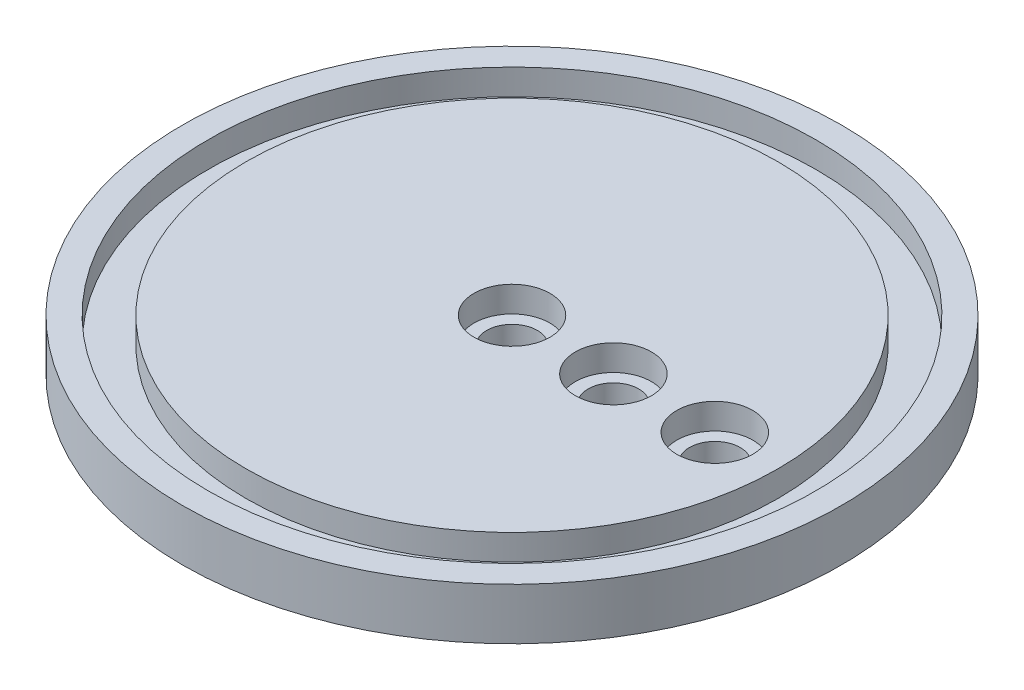
ISO-10303-21;
HEADER;
FILE_DESCRIPTION(('STEP AP214'),'2;1');
FILE_NAME('part.step','',(''),(''),'','','');
FILE_SCHEMA(('AUTOMOTIVE_DESIGN { 1 0 10303 214 1 1 1 1 }'));
ENDSEC;
DATA;
#1=APPLICATION_CONTEXT('core data for automotive mechanical design processes');
#2=APPLICATION_PROTOCOL_DEFINITION('international standard','automotive_design',2000,#1);
#3=PRODUCT_CONTEXT('',#1,'mechanical');
#4=PRODUCT('Part','Part','',(#3));
#5=PRODUCT_RELATED_PRODUCT_CATEGORY('part','',(#4));
#6=PRODUCT_DEFINITION_FORMATION('','',#4);
#7=PRODUCT_DEFINITION_CONTEXT('part definition',#1,'design');
#8=PRODUCT_DEFINITION('design','',#6,#7);
#9=PRODUCT_DEFINITION_SHAPE('','',#8);
#10=(LENGTH_UNIT() NAMED_UNIT(*) SI_UNIT(.MILLI.,.METRE.));
#11=(NAMED_UNIT(*) PLANE_ANGLE_UNIT() SI_UNIT($,.RADIAN.));
#12=(NAMED_UNIT(*) SI_UNIT($,.STERADIAN.) SOLID_ANGLE_UNIT());
#13=UNCERTAINTY_MEASURE_WITH_UNIT(LENGTH_MEASURE(1.E-05),#10,'distance_accuracy_value','');
#14=(GEOMETRIC_REPRESENTATION_CONTEXT(3) GLOBAL_UNCERTAINTY_ASSIGNED_CONTEXT((#13)) GLOBAL_UNIT_ASSIGNED_CONTEXT((#10,
#11,#12)) REPRESENTATION_CONTEXT('',''));
#15=CARTESIAN_POINT('',(0.,0.,0.));
#16=DIRECTION('',(0.,0.,1.));
#17=DIRECTION('',(1.,0.,0.));
#18=AXIS2_PLACEMENT_3D('',#15,#16,#17);
#19=CARTESIAN_POINT('',(0.,1.016,0.));
#20=DIRECTION('',(0.,1.,0.));
#21=DIRECTION('',(0.,0.,1.));
#22=AXIS2_PLACEMENT_3D('',#19,#20,#21);
#23=PLANE('',#22);
#24=CARTESIAN_POINT('',(8.,1.016,0.));
#25=DIRECTION('',(0.,1.,0.));
#26=DIRECTION('',(0.,0.,1.));
#27=AXIS2_PLACEMENT_3D('',#24,#25,#26);
#28=CIRCLE('',#27,1.);
#29=CARTESIAN_POINT('',(8.,1.016,1.));
#30=VERTEX_POINT('',#29);
#31=EDGE_CURVE('E73',#30,#30,#28,.T.);
#32=ORIENTED_EDGE('',*,*,#31,.F.);
#33=EDGE_LOOP('',(#32));
#34=FACE_BOUND('',#33,.T.);
#35=CARTESIAN_POINT('',(8.,1.016,0.));
#36=DIRECTION('',(0.,1.,0.));
#37=DIRECTION('',(0.,0.,1.));
#38=AXIS2_PLACEMENT_3D('',#35,#36,#37);
#39=CIRCLE('',#38,1.5);
#40=CARTESIAN_POINT('',(8.,1.016,1.5));
#41=VERTEX_POINT('',#40);
#42=EDGE_CURVE('E11',#41,#41,#39,.F.);
#43=ORIENTED_EDGE('',*,*,#42,.F.);
#44=EDGE_LOOP('',(#43));
#45=FACE_BOUND('',#44,.T.);
#46=ADVANCED_FACE('F40',(#34,#45),#23,.T.);
#47=CARTESIAN_POINT('',(4.,1.016,0.));
#48=DIRECTION('',(0.,1.,0.));
#49=DIRECTION('',(0.,0.,1.));
#50=AXIS2_PLACEMENT_3D('',#47,#48,#49);
#51=CIRCLE('',#50,1.);
#52=CARTESIAN_POINT('',(4.,1.016,1.));
#53=VERTEX_POINT('',#52);
#54=EDGE_CURVE('E67',#53,#53,#51,.T.);
#55=ORIENTED_EDGE('',*,*,#54,.F.);
#56=EDGE_LOOP('',(#55));
#57=FACE_BOUND('',#56,.T.);
#58=CARTESIAN_POINT('',(4.,1.016,0.));
#59=DIRECTION('',(0.,1.,0.));
#60=DIRECTION('',(0.,0.,1.));
#61=AXIS2_PLACEMENT_3D('',#58,#59,#60);
#62=CIRCLE('',#61,1.5);
#63=CARTESIAN_POINT('',(4.,1.016,1.5));
#64=VERTEX_POINT('',#63);
#65=EDGE_CURVE('E47',#64,#64,#62,.F.);
#66=ORIENTED_EDGE('',*,*,#65,.F.);
#67=EDGE_LOOP('',(#66));
#68=FACE_BOUND('',#67,.T.);
#69=ADVANCED_FACE('F147',(#57,#68),#23,.T.);
#70=CARTESIAN_POINT('',(0.,1.016,0.));
#71=DIRECTION('',(0.,1.,0.));
#72=DIRECTION('',(0.,0.,1.));
#73=AXIS2_PLACEMENT_3D('',#70,#71,#72);
#74=CIRCLE('',#73,1.);
#75=CARTESIAN_POINT('',(0.,1.016,1.));
#76=VERTEX_POINT('',#75);
#77=EDGE_CURVE('E63',#76,#76,#74,.T.);
#78=ORIENTED_EDGE('',*,*,#77,.F.);
#79=EDGE_LOOP('',(#78));
#80=FACE_BOUND('',#79,.T.);
#81=CARTESIAN_POINT('',(0.,1.016,0.));
#82=DIRECTION('',(0.,1.,0.));
#83=DIRECTION('',(0.,0.,1.));
#84=AXIS2_PLACEMENT_3D('',#81,#82,#83);
#85=CIRCLE('',#84,1.5);
#86=CARTESIAN_POINT('',(0.,1.016,1.5));
#87=VERTEX_POINT('',#86);
#88=EDGE_CURVE('E51',#87,#87,#85,.F.);
#89=ORIENTED_EDGE('',*,*,#88,.F.);
#90=EDGE_LOOP('',(#89));
#91=FACE_BOUND('',#90,.T.);
#92=ADVANCED_FACE('F126',(#80,#91),#23,.T.);
#93=CARTESIAN_POINT('',(0.,1.016,0.));
#94=DIRECTION('',(0.,1.,0.));
#95=DIRECTION('',(0.,0.,1.));
#96=AXIS2_PLACEMENT_3D('',#93,#94,#95);
#97=CIRCLE('',#96,10.4920000000003);
#98=CARTESIAN_POINT('',(0.,1.016,10.4920000000003));
#99=VERTEX_POINT('',#98);
#100=EDGE_CURVE('E88',#99,#99,#97,.T.);
#101=ORIENTED_EDGE('',*,*,#100,.F.);
#102=EDGE_LOOP('',(#101));
#103=FACE_BOUND('',#102,.T.);
#104=CARTESIAN_POINT('',(0.,1.016,0.));
#105=DIRECTION('',(0.,1.,0.));
#106=DIRECTION('',(0.,0.,1.));
#107=AXIS2_PLACEMENT_3D('',#104,#105,#106);
#108=CIRCLE('',#107,11.9920000000003);
#109=CARTESIAN_POINT('',(0.,1.016,11.9920000000003));
#110=VERTEX_POINT('',#109);
#111=EDGE_CURVE('E55',#110,#110,#108,.F.);
#112=ORIENTED_EDGE('',*,*,#111,.F.);
#113=EDGE_LOOP('',(#112));
#114=FACE_BOUND('',#113,.T.);
#115=ADVANCED_FACE('F122',(#103,#114),#23,.T.);
#116=CARTESIAN_POINT('',(0.,0.,0.));
#117=DIRECTION('',(0.,1.,0.));
#118=DIRECTION('',(0.,0.,1.));
#119=AXIS2_PLACEMENT_3D('',#116,#117,#118);
#120=PLANE('',#119);
#121=CARTESIAN_POINT('',(0.,0.,0.));
#122=DIRECTION('',(0.,1.,0.));
#123=DIRECTION('',(0.,0.,1.));
#124=AXIS2_PLACEMENT_3D('',#121,#122,#123);
#125=CIRCLE('',#124,13.);
#126=CARTESIAN_POINT('',(0.,0.,13.));
#127=VERTEX_POINT('',#126);
#128=EDGE_CURVE('E60',#127,#127,#125,.T.);
#129=ORIENTED_EDGE('',*,*,#128,.F.);
#130=EDGE_LOOP('',(#129));
#131=FACE_BOUND('',#130,.T.);
#132=CARTESIAN_POINT('',(0.,0.,0.));
#133=DIRECTION('',(0.,1.,0.));
#134=DIRECTION('',(0.,0.,1.));
#135=AXIS2_PLACEMENT_3D('',#132,#133,#134);
#136=CIRCLE('',#135,1.);
#137=CARTESIAN_POINT('',(0.,0.,1.));
#138=VERTEX_POINT('',#137);
#139=EDGE_CURVE('E64',#138,#138,#136,.T.);
#140=ORIENTED_EDGE('',*,*,#139,.T.);
#141=EDGE_LOOP('',(#140));
#142=FACE_BOUND('',#141,.T.);
#143=CARTESIAN_POINT('',(4.,0.,0.));
#144=DIRECTION('',(0.,1.,0.));
#145=DIRECTION('',(0.,0.,1.));
#146=AXIS2_PLACEMENT_3D('',#143,#144,#145);
#147=CIRCLE('',#146,1.);
#148=CARTESIAN_POINT('',(4.,0.,1.));
#149=VERTEX_POINT('',#148);
#150=EDGE_CURVE('E70',#149,#149,#147,.T.);
#151=ORIENTED_EDGE('',*,*,#150,.T.);
#152=EDGE_LOOP('',(#151));
#153=FACE_BOUND('',#152,.T.);
#154=CARTESIAN_POINT('',(8.,0.,0.));
#155=DIRECTION('',(0.,1.,0.));
#156=DIRECTION('',(0.,0.,1.));
#157=AXIS2_PLACEMENT_3D('',#154,#155,#156);
#158=CIRCLE('',#157,1.);
#159=CARTESIAN_POINT('',(8.,0.,1.));
#160=VERTEX_POINT('',#159);
#161=EDGE_CURVE('E76',#160,#160,#158,.T.);
#162=ORIENTED_EDGE('',*,*,#161,.T.);
#163=EDGE_LOOP('',(#162));
#164=FACE_BOUND('',#163,.T.);
#165=ADVANCED_FACE('F125',(#131,#142,#153,#164),#120,.F.);
#166=CARTESIAN_POINT('',(0.,1.016,0.));
#167=DIRECTION('',(0.,-1.,0.));
#168=DIRECTION('',(0.,0.,-1.));
#169=AXIS2_PLACEMENT_3D('',#166,#167,#168);
#170=CYLINDRICAL_SURFACE('',#169,13.);
#171=ORIENTED_EDGE('',*,*,#128,.T.);
#172=EDGE_LOOP('',(#171));
#173=FACE_BOUND('',#172,.T.);
#174=CARTESIAN_POINT('',(0.,2.032,0.));
#175=DIRECTION('',(0.,1.,0.));
#176=DIRECTION('',(0.,0.,1.));
#177=AXIS2_PLACEMENT_3D('',#174,#175,#176);
#178=CIRCLE('',#177,13.);
#179=CARTESIAN_POINT('',(0.,2.032,13.));
#180=VERTEX_POINT('',#179);
#181=EDGE_CURVE('E79',#180,#180,#178,.T.);
#182=ORIENTED_EDGE('',*,*,#181,.F.);
#183=EDGE_LOOP('',(#182));
#184=FACE_BOUND('',#183,.T.);
#185=ADVANCED_FACE('F42',(#173,#184),#170,.T.);
#186=CARTESIAN_POINT('',(0.,1.016,0.));
#187=DIRECTION('',(0.,-1.,0.));
#188=DIRECTION('',(0.,0.,-1.));
#189=AXIS2_PLACEMENT_3D('',#186,#187,#188);
#190=CYLINDRICAL_SURFACE('',#189,1.);
#191=ORIENTED_EDGE('',*,*,#77,.T.);
#192=EDGE_LOOP('',(#191));
#193=FACE_BOUND('',#192,.T.);
#194=ORIENTED_EDGE('',*,*,#139,.F.);
#195=EDGE_LOOP('',(#194));
#196=FACE_BOUND('',#195,.T.);
#197=ADVANCED_FACE('F156',(#193,#196),#190,.F.);
#198=CARTESIAN_POINT('',(4.,1.016,0.));
#199=DIRECTION('',(0.,-1.,0.));
#200=DIRECTION('',(0.,0.,-1.));
#201=AXIS2_PLACEMENT_3D('',#198,#199,#200);
#202=CYLINDRICAL_SURFACE('',#201,1.);
#203=ORIENTED_EDGE('',*,*,#54,.T.);
#204=EDGE_LOOP('',(#203));
#205=FACE_BOUND('',#204,.T.);
#206=ORIENTED_EDGE('',*,*,#150,.F.);
#207=EDGE_LOOP('',(#206));
#208=FACE_BOUND('',#207,.T.);
#209=ADVANCED_FACE('F143',(#205,#208),#202,.F.);
#210=CARTESIAN_POINT('',(8.,1.016,0.));
#211=DIRECTION('',(0.,-1.,0.));
#212=DIRECTION('',(0.,0.,-1.));
#213=AXIS2_PLACEMENT_3D('',#210,#211,#212);
#214=CYLINDRICAL_SURFACE('',#213,1.);
#215=ORIENTED_EDGE('',*,*,#31,.T.);
#216=EDGE_LOOP('',(#215));
#217=FACE_BOUND('',#216,.T.);
#218=ORIENTED_EDGE('',*,*,#161,.F.);
#219=EDGE_LOOP('',(#218));
#220=FACE_BOUND('',#219,.T.);
#221=ADVANCED_FACE('F133',(#217,#220),#214,.F.);
#222=CARTESIAN_POINT('',(0.,2.032,0.));
#223=DIRECTION('',(0.,-1.,0.));
#224=DIRECTION('',(0.,0.,-1.));
#225=AXIS2_PLACEMENT_3D('',#222,#223,#224);
#226=CYLINDRICAL_SURFACE('',#225,11.9920000000003);
#227=CARTESIAN_POINT('',(0.,2.032,0.));
#228=DIRECTION('',(0.,1.,0.));
#229=DIRECTION('',(0.,0.,1.));
#230=AXIS2_PLACEMENT_3D('',#227,#228,#229);
#231=CIRCLE('',#230,11.9920000000003);
#232=CARTESIAN_POINT('',(0.,2.032,11.9920000000003));
#233=VERTEX_POINT('',#232);
#234=EDGE_CURVE('E84',#233,#233,#231,.T.);
#235=ORIENTED_EDGE('',*,*,#234,.T.);
#236=EDGE_LOOP('',(#235));
#237=FACE_BOUND('',#236,.T.);
#238=ORIENTED_EDGE('',*,*,#111,.T.);
#239=EDGE_LOOP('',(#238));
#240=FACE_BOUND('',#239,.T.);
#241=ADVANCED_FACE('F130',(#237,#240),#226,.F.);
#242=CARTESIAN_POINT('',(0.,2.032,0.));
#243=DIRECTION('',(0.,1.,0.));
#244=DIRECTION('',(0.,0.,1.));
#245=AXIS2_PLACEMENT_3D('',#242,#243,#244);
#246=PLANE('',#245);
#247=ORIENTED_EDGE('',*,*,#234,.F.);
#248=EDGE_LOOP('',(#247));
#249=FACE_BOUND('',#248,.T.);
#250=ORIENTED_EDGE('',*,*,#181,.T.);
#251=EDGE_LOOP('',(#250));
#252=FACE_BOUND('',#251,.T.);
#253=ADVANCED_FACE('F132',(#249,#252),#246,.T.);
#254=CARTESIAN_POINT('',(8.,2.032,0.));
#255=DIRECTION('',(0.,-1.,0.));
#256=DIRECTION('',(0.,0.,-1.));
#257=AXIS2_PLACEMENT_3D('',#254,#255,#256);
#258=CYLINDRICAL_SURFACE('',#257,1.5);
#259=CARTESIAN_POINT('',(8.,2.032,0.));
#260=DIRECTION('',(0.,1.,0.));
#261=DIRECTION('',(0.,0.,1.));
#262=AXIS2_PLACEMENT_3D('',#259,#260,#261);
#263=CIRCLE('',#262,1.5);
#264=CARTESIAN_POINT('',(8.,2.032,1.5));
#265=VERTEX_POINT('',#264);
#266=EDGE_CURVE('E94',#265,#265,#263,.T.);
#267=ORIENTED_EDGE('',*,*,#266,.T.);
#268=EDGE_LOOP('',(#267));
#269=FACE_BOUND('',#268,.T.);
#270=ORIENTED_EDGE('',*,*,#42,.T.);
#271=EDGE_LOOP('',(#270));
#272=FACE_BOUND('',#271,.T.);
#273=ADVANCED_FACE('F140',(#269,#272),#258,.F.);
#274=CARTESIAN_POINT('',(4.,2.032,0.));
#275=DIRECTION('',(0.,-1.,0.));
#276=DIRECTION('',(0.,0.,-1.));
#277=AXIS2_PLACEMENT_3D('',#274,#275,#276);
#278=CYLINDRICAL_SURFACE('',#277,1.5);
#279=CARTESIAN_POINT('',(4.,2.032,0.));
#280=DIRECTION('',(0.,1.,0.));
#281=DIRECTION('',(0.,0.,1.));
#282=AXIS2_PLACEMENT_3D('',#279,#280,#281);
#283=CIRCLE('',#282,1.5);
#284=CARTESIAN_POINT('',(4.,2.032,1.5));
#285=VERTEX_POINT('',#284);
#286=EDGE_CURVE('E97',#285,#285,#283,.T.);
#287=ORIENTED_EDGE('',*,*,#286,.T.);
#288=EDGE_LOOP('',(#287));
#289=FACE_BOUND('',#288,.T.);
#290=ORIENTED_EDGE('',*,*,#65,.T.);
#291=EDGE_LOOP('',(#290));
#292=FACE_BOUND('',#291,.T.);
#293=ADVANCED_FACE('F190',(#289,#292),#278,.F.);
#294=CARTESIAN_POINT('',(0.,2.032,0.));
#295=DIRECTION('',(0.,-1.,0.));
#296=DIRECTION('',(0.,0.,-1.));
#297=AXIS2_PLACEMENT_3D('',#294,#295,#296);
#298=CYLINDRICAL_SURFACE('',#297,1.5);
#299=CARTESIAN_POINT('',(0.,2.032,0.));
#300=DIRECTION('',(0.,1.,0.));
#301=DIRECTION('',(0.,0.,1.));
#302=AXIS2_PLACEMENT_3D('',#299,#300,#301);
#303=CIRCLE('',#302,1.5);
#304=CARTESIAN_POINT('',(0.,2.032,1.5));
#305=VERTEX_POINT('',#304);
#306=EDGE_CURVE('E91',#305,#305,#303,.T.);
#307=ORIENTED_EDGE('',*,*,#306,.T.);
#308=EDGE_LOOP('',(#307));
#309=FACE_BOUND('',#308,.T.);
#310=ORIENTED_EDGE('',*,*,#88,.T.);
#311=EDGE_LOOP('',(#310));
#312=FACE_BOUND('',#311,.T.);
#313=ADVANCED_FACE('F103',(#309,#312),#298,.F.);
#314=CARTESIAN_POINT('',(0.,2.032,0.));
#315=DIRECTION('',(0.,-1.,0.));
#316=DIRECTION('',(0.,0.,-1.));
#317=AXIS2_PLACEMENT_3D('',#314,#315,#316);
#318=CYLINDRICAL_SURFACE('',#317,10.4920000000003);
#319=CARTESIAN_POINT('',(0.,2.032,0.));
#320=DIRECTION('',(0.,1.,0.));
#321=DIRECTION('',(0.,0.,1.));
#322=AXIS2_PLACEMENT_3D('',#319,#320,#321);
#323=CIRCLE('',#322,10.4920000000003);
#324=CARTESIAN_POINT('',(0.,2.032,10.4920000000003));
#325=VERTEX_POINT('',#324);
#326=EDGE_CURVE('E87',#325,#325,#323,.T.);
#327=ORIENTED_EDGE('',*,*,#326,.F.);
#328=EDGE_LOOP('',(#327));
#329=FACE_BOUND('',#328,.T.);
#330=ORIENTED_EDGE('',*,*,#100,.T.);
#331=EDGE_LOOP('',(#330));
#332=FACE_BOUND('',#331,.T.);
#333=ADVANCED_FACE('F109',(#329,#332),#318,.T.);
#334=CARTESIAN_POINT('',(0.,2.032,0.));
#335=DIRECTION('',(0.,1.,0.));
#336=DIRECTION('',(0.,0.,1.));
#337=AXIS2_PLACEMENT_3D('',#334,#335,#336);
#338=PLANE('',#337);
#339=ORIENTED_EDGE('',*,*,#306,.F.);
#340=EDGE_LOOP('',(#339));
#341=FACE_BOUND('',#340,.T.);
#342=ORIENTED_EDGE('',*,*,#286,.F.);
#343=EDGE_LOOP('',(#342));
#344=FACE_BOUND('',#343,.T.);
#345=ORIENTED_EDGE('',*,*,#266,.F.);
#346=EDGE_LOOP('',(#345));
#347=FACE_BOUND('',#346,.T.);
#348=ORIENTED_EDGE('',*,*,#326,.T.);
#349=EDGE_LOOP('',(#348));
#350=FACE_BOUND('',#349,.T.);
#351=ADVANCED_FACE('F106',(#341,#344,#347,#350),#338,.T.);
#352=CLOSED_SHELL('',(#46,#69,#92,#115,#165,#185,#197,#209,#221,#241,#253,#273,#293,#313,#333,#351));
#353=MANIFOLD_SOLID_BREP('B2',#352);
#354=ADVANCED_BREP_SHAPE_REPRESENTATION('',(#18,#353),#14);
#355=SHAPE_DEFINITION_REPRESENTATION(#9,#354);
ENDSEC;
END-ISO-10303-21;
